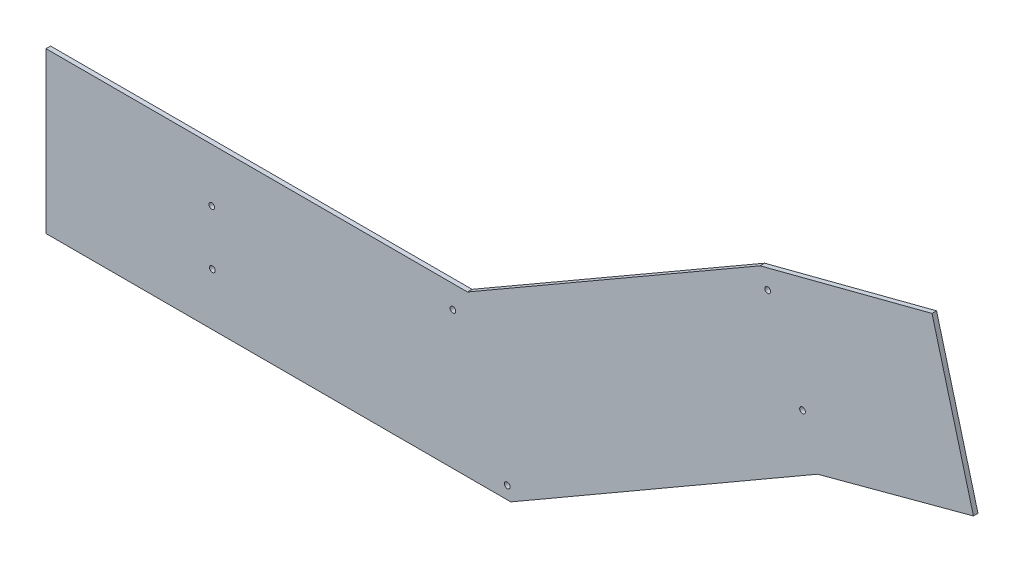
ISO-10303-21;
HEADER;
FILE_DESCRIPTION(('STEP AP214'),'2;1');
FILE_NAME('part.step','',(''),(''),'','','');
FILE_SCHEMA(('AUTOMOTIVE_DESIGN { 1 0 10303 214 1 1 1 1 }'));
ENDSEC;
DATA;
#1=APPLICATION_CONTEXT('core data for automotive mechanical design processes');
#2=APPLICATION_PROTOCOL_DEFINITION('international standard','automotive_design',2000,#1);
#3=PRODUCT_CONTEXT('',#1,'mechanical');
#4=PRODUCT('Part','Part','',(#3));
#5=PRODUCT_RELATED_PRODUCT_CATEGORY('part','',(#4));
#6=PRODUCT_DEFINITION_FORMATION('','',#4);
#7=PRODUCT_DEFINITION_CONTEXT('part definition',#1,'design');
#8=PRODUCT_DEFINITION('design','',#6,#7);
#9=PRODUCT_DEFINITION_SHAPE('','',#8);
#10=(LENGTH_UNIT() NAMED_UNIT(*) SI_UNIT(.MILLI.,.METRE.));
#11=(NAMED_UNIT(*) PLANE_ANGLE_UNIT() SI_UNIT($,.RADIAN.));
#12=(NAMED_UNIT(*) SI_UNIT($,.STERADIAN.) SOLID_ANGLE_UNIT());
#13=UNCERTAINTY_MEASURE_WITH_UNIT(LENGTH_MEASURE(1.E-05),#10,'distance_accuracy_value','');
#14=(GEOMETRIC_REPRESENTATION_CONTEXT(3) GLOBAL_UNCERTAINTY_ASSIGNED_CONTEXT((#13)) GLOBAL_UNIT_ASSIGNED_CONTEXT((#10,
#11,#12)) REPRESENTATION_CONTEXT('',''));
#15=CARTESIAN_POINT('',(0.,0.,0.));
#16=DIRECTION('',(0.,0.,1.));
#17=DIRECTION('',(1.,0.,0.));
#18=AXIS2_PLACEMENT_3D('',#15,#16,#17);
#19=CARTESIAN_POINT('',(-172.3738737223,0.,1.6));
#20=DIRECTION('',(1.,0.,0.));
#21=DIRECTION('',(0.,0.,-1.));
#22=AXIS2_PLACEMENT_3D('',#19,#20,#21);
#23=PLANE('',#22);
#24=DIRECTION('',(0.,-1.,0.));
#25=VECTOR('',#24,1.);
#26=CARTESIAN_POINT('',(-172.3738737223,0.,0.));
#27=LINE('',#26,#25);
#28=CARTESIAN_POINT('',(-172.3738737223,5.2915159966,0.));
#29=VERTEX_POINT('',#28);
#30=CARTESIAN_POINT('',(-172.3738737223,-50.8584876976,0.));
#31=VERTEX_POINT('',#30);
#32=EDGE_CURVE('E156',#29,#31,#27,.T.);
#33=ORIENTED_EDGE('',*,*,#32,.T.);
#34=DIRECTION('',(0.,0.,-1.));
#35=VECTOR('',#34,1.);
#36=CARTESIAN_POINT('',(-172.3738737223,-50.8584876976,1.6));
#37=LINE('',#36,#35);
#38=CARTESIAN_POINT('',(-172.3738737223,-50.8584876976,1.6));
#39=VERTEX_POINT('',#38);
#40=EDGE_CURVE('E11',#39,#31,#37,.T.);
#41=ORIENTED_EDGE('',*,*,#40,.F.);
#42=DIRECTION('',(0.,-1.,0.));
#43=VECTOR('',#42,1.);
#44=CARTESIAN_POINT('',(-172.3738737223,0.,1.6));
#45=LINE('',#44,#43);
#46=CARTESIAN_POINT('',(-172.3738737223,5.2915159966,1.6));
#47=VERTEX_POINT('',#46);
#48=EDGE_CURVE('E206',#47,#39,#45,.T.);
#49=ORIENTED_EDGE('',*,*,#48,.F.);
#50=DIRECTION('',(0.,0.,-1.));
#51=VECTOR('',#50,1.);
#52=CARTESIAN_POINT('',(-172.3738737223,5.2915159966,1.6));
#53=LINE('',#52,#51);
#54=EDGE_CURVE('E134',#47,#29,#53,.T.);
#55=ORIENTED_EDGE('',*,*,#54,.T.);
#56=EDGE_LOOP('',(#33,#41,#49,#55));
#57=FACE_BOUND('',#56,.T.);
#58=ADVANCED_FACE('F41',(#57),#23,.F.);
#59=CARTESIAN_POINT('',(0.,-50.8584876976,1.6));
#60=DIRECTION('',(0.,1.,0.));
#61=DIRECTION('',(0.,0.,1.));
#62=AXIS2_PLACEMENT_3D('',#59,#60,#61);
#63=PLANE('',#62);
#64=DIRECTION('',(1.,0.,0.));
#65=VECTOR('',#64,1.);
#66=CARTESIAN_POINT('',(0.,-50.8584876976,0.));
#67=LINE('',#66,#65);
#68=CARTESIAN_POINT('',(-9.3985925441,-50.8584876976,0.));
#69=VERTEX_POINT('',#68);
#70=EDGE_CURVE('E159',#31,#69,#67,.T.);
#71=ORIENTED_EDGE('',*,*,#70,.T.);
#72=DIRECTION('',(0.,0.,-1.));
#73=VECTOR('',#72,1.);
#74=CARTESIAN_POINT('',(-9.3985925441,-50.8584876976,1.6));
#75=LINE('',#74,#73);
#76=CARTESIAN_POINT('',(-9.3985925441,-50.8584876976,1.6));
#77=VERTEX_POINT('',#76);
#78=EDGE_CURVE('E50',#77,#69,#75,.T.);
#79=ORIENTED_EDGE('',*,*,#78,.F.);
#80=DIRECTION('',(1.,0.,0.));
#81=VECTOR('',#80,1.);
#82=CARTESIAN_POINT('',(0.,-50.8584876976,1.6));
#83=LINE('',#82,#81);
#84=EDGE_CURVE('E97',#39,#77,#83,.T.);
#85=ORIENTED_EDGE('',*,*,#84,.F.);
#86=ORIENTED_EDGE('',*,*,#40,.T.);
#87=EDGE_LOOP('',(#71,#79,#85,#86));
#88=FACE_BOUND('',#87,.T.);
#89=ADVANCED_FACE('F257',(#88),#63,.F.);
#90=CARTESIAN_POINT('',(19.6843399299299,-34.0413349853203,1.6));
#91=DIRECTION('',(-0.500582868753158,0.865688622722315,0.));
#92=DIRECTION('',(-0.865688622722315,-0.500582868753158,0.));
#93=AXIS2_PLACEMENT_3D('',#90,#91,#92);
#94=PLANE('',#93);
#95=DIRECTION('',(0.865688622722315,0.500582868753158,0.));
#96=VECTOR('',#95,1.);
#97=CARTESIAN_POINT('',(19.6843399299299,-34.0413349853203,0.));
#98=LINE('',#97,#96);
#99=CARTESIAN_POINT('',(98.1505954559,11.3316343024,0.));
#100=VERTEX_POINT('',#99);
#101=EDGE_CURVE('E162',#69,#100,#98,.T.);
#102=ORIENTED_EDGE('',*,*,#101,.T.);
#103=DIRECTION('',(0.,0.,-1.));
#104=VECTOR('',#103,1.);
#105=CARTESIAN_POINT('',(98.1505954559,11.3316343024,1.6));
#106=LINE('',#105,#104);
#107=CARTESIAN_POINT('',(98.1505954559,11.3316343024,1.6));
#108=VERTEX_POINT('',#107);
#109=EDGE_CURVE('E180',#108,#100,#106,.T.);
#110=ORIENTED_EDGE('',*,*,#109,.F.);
#111=DIRECTION('',(0.865688622722315,0.500582868753158,0.));
#112=VECTOR('',#111,1.);
#113=CARTESIAN_POINT('',(19.6843399299299,-34.0413349853203,1.6));
#114=LINE('',#113,#112);
#115=EDGE_CURVE('E188',#77,#108,#114,.T.);
#116=ORIENTED_EDGE('',*,*,#115,.F.);
#117=ORIENTED_EDGE('',*,*,#78,.T.);
#118=EDGE_LOOP('',(#102,#110,#116,#117));
#119=FACE_BOUND('',#118,.T.);
#120=ADVANCED_FACE('F186',(#119),#94,.F.);
#121=CARTESIAN_POINT('',(3.73773680687827,-13.9553933314862,1.6));
#122=DIRECTION('',(-0.258715742758168,0.965953500148475,0.));
#123=DIRECTION('',(-0.965953500148475,-0.258715742758168,0.));
#124=AXIS2_PLACEMENT_3D('',#121,#122,#123);
#125=PLANE('',#124);
#126=DIRECTION('',(0.965953500148475,0.258715742758168,0.));
#127=VECTOR('',#126,1.);
#128=CARTESIAN_POINT('',(3.73773680687827,-13.9553933314862,0.));
#129=LINE('',#128,#127);
#130=CARTESIAN_POINT('',(152.8113954559,25.9716863024,0.));
#131=VERTEX_POINT('',#130);
#132=EDGE_CURVE('E164',#100,#131,#129,.T.);
#133=ORIENTED_EDGE('',*,*,#132,.T.);
#134=DIRECTION('',(0.,0.,-1.));
#135=VECTOR('',#134,1.);
#136=CARTESIAN_POINT('',(152.8113954559,25.9716863024,1.6));
#137=LINE('',#136,#135);
#138=CARTESIAN_POINT('',(152.8113954559,25.9716863024,1.6));
#139=VERTEX_POINT('',#138);
#140=EDGE_CURVE('E177',#139,#131,#137,.T.);
#141=ORIENTED_EDGE('',*,*,#140,.F.);
#142=DIRECTION('',(0.965953500148475,0.258715742758168,0.));
#143=VECTOR('',#142,1.);
#144=CARTESIAN_POINT('',(3.73773680687827,-13.9553933314862,1.6));
#145=LINE('',#144,#143);
#146=EDGE_CURVE('E200',#108,#139,#145,.T.);
#147=ORIENTED_EDGE('',*,*,#146,.F.);
#148=ORIENTED_EDGE('',*,*,#109,.T.);
#149=EDGE_LOOP('',(#133,#141,#147,#148));
#150=FACE_BOUND('',#149,.T.);
#151=ADVANCED_FACE('F196',(#150),#125,.F.);
#152=CARTESIAN_POINT('',(149.074751685058,39.9241312300911,1.6));
#153=DIRECTION('',(-0.965958748430131,-0.2586961467268,0.));
#154=DIRECTION('',(0.2586961467268,-0.965958748430131,0.));
#155=AXIS2_PLACEMENT_3D('',#152,#153,#154);
#156=PLANE('',#155);
#157=DIRECTION('',(-0.2586961467268,0.965958748430132,0.));
#158=VECTOR('',#157,1.);
#159=CARTESIAN_POINT('',(149.074751685058,39.9241312300911,0.));
#160=LINE('',#159,#158);
#161=CARTESIAN_POINT('',(138.2825954559,80.2215143024,0.));
#162=VERTEX_POINT('',#161);
#163=EDGE_CURVE('E166',#131,#162,#160,.T.);
#164=ORIENTED_EDGE('',*,*,#163,.T.);
#165=DIRECTION('',(0.,0.,-1.));
#166=VECTOR('',#165,1.);
#167=CARTESIAN_POINT('',(138.2825954559,80.2215143024,1.6));
#168=LINE('',#167,#166);
#169=CARTESIAN_POINT('',(138.2825954559,80.2215143024,1.6));
#170=VERTEX_POINT('',#169);
#171=EDGE_CURVE('E129',#170,#162,#168,.T.);
#172=ORIENTED_EDGE('',*,*,#171,.F.);
#173=DIRECTION('',(-0.2586961467268,0.965958748430132,0.));
#174=VECTOR('',#173,1.);
#175=CARTESIAN_POINT('',(149.074751685058,39.9241312300911,1.6));
#176=LINE('',#175,#174);
#177=EDGE_CURVE('E116',#139,#170,#176,.T.);
#178=ORIENTED_EDGE('',*,*,#177,.F.);
#179=ORIENTED_EDGE('',*,*,#140,.T.);
#180=EDGE_LOOP('',(#164,#172,#178,#179));
#181=FACE_BOUND('',#180,.T.);
#182=ADVANCED_FACE('F199',(#181),#156,.F.);
#183=CARTESIAN_POINT('',(-10.7812892949243,41.4419124083552,1.6));
#184=DIRECTION('',(0.251773670164605,-0.967786143221654,0.));
#185=DIRECTION('',(0.967786143221654,0.251773670164605,0.));
#186=AXIS2_PLACEMENT_3D('',#183,#184,#185);
#187=PLANE('',#186);
#188=DIRECTION('',(-0.967786143221655,-0.251773670164605,0.));
#189=VECTOR('',#188,1.);
#190=CARTESIAN_POINT('',(-10.7812892949243,41.4419124083552,0.));
#191=LINE('',#190,#189);
#192=CARTESIAN_POINT('',(78.0109354559,64.5415863024,0.));
#193=VERTEX_POINT('',#192);
#194=EDGE_CURVE('E125',#162,#193,#191,.T.);
#195=ORIENTED_EDGE('',*,*,#194,.T.);
#196=DIRECTION('',(0.,0.,-1.));
#197=VECTOR('',#196,1.);
#198=CARTESIAN_POINT('',(78.0109354559,64.5415863024,1.6));
#199=LINE('',#198,#197);
#200=CARTESIAN_POINT('',(78.0109354559,64.5415863024,1.6));
#201=VERTEX_POINT('',#200);
#202=EDGE_CURVE('E122',#201,#193,#199,.T.);
#203=ORIENTED_EDGE('',*,*,#202,.F.);
#204=DIRECTION('',(-0.967786143221655,-0.251773670164605,0.));
#205=VECTOR('',#204,1.);
#206=CARTESIAN_POINT('',(-10.7812892949243,41.4419124083552,1.6));
#207=LINE('',#206,#205);
#208=EDGE_CURVE('E110',#170,#201,#207,.T.);
#209=ORIENTED_EDGE('',*,*,#208,.F.);
#210=ORIENTED_EDGE('',*,*,#171,.T.);
#211=EDGE_LOOP('',(#195,#203,#209,#210));
#212=FACE_BOUND('',#211,.T.);
#213=ADVANCED_FACE('F123',(#212),#187,.F.);
#214=CARTESIAN_POINT('',(-8.44354314677224,14.6236412480124,1.6));
#215=DIRECTION('',(-0.500025757578258,0.866010532128963,0.));
#216=DIRECTION('',(-0.866010532128963,-0.500025757578258,0.));
#217=AXIS2_PLACEMENT_3D('',#214,#215,#216);
#218=PLANE('',#217);
#219=DIRECTION('',(0.866010532128963,0.500025757578258,0.));
#220=VECTOR('',#219,1.);
#221=CARTESIAN_POINT('',(-8.44354314677224,14.6236412480124,0.));
#222=LINE('',#221,#220);
#223=CARTESIAN_POINT('',(-24.5885545441,5.3016743024,0.));
#224=VERTEX_POINT('',#223);
#225=EDGE_CURVE('E169',#224,#193,#222,.T.);
#226=ORIENTED_EDGE('',*,*,#225,.F.);
#227=DIRECTION('',(0.,0.,-1.));
#228=VECTOR('',#227,1.);
#229=CARTESIAN_POINT('',(-24.5885545441,5.3016743024,1.6));
#230=LINE('',#229,#228);
#231=CARTESIAN_POINT('',(-24.5885545441,5.3016743024,1.6));
#232=VERTEX_POINT('',#231);
#233=EDGE_CURVE('E86',#232,#224,#230,.T.);
#234=ORIENTED_EDGE('',*,*,#233,.F.);
#235=DIRECTION('',(0.866010532128963,0.500025757578258,0.));
#236=VECTOR('',#235,1.);
#237=CARTESIAN_POINT('',(-8.44354314677224,14.6236412480124,1.6));
#238=LINE('',#237,#236);
#239=EDGE_CURVE('E114',#232,#201,#238,.T.);
#240=ORIENTED_EDGE('',*,*,#239,.T.);
#241=ORIENTED_EDGE('',*,*,#202,.T.);
#242=EDGE_LOOP('',(#226,#234,#240,#241));
#243=FACE_BOUND('',#242,.T.);
#244=ADVANCED_FACE('F131',(#243),#218,.T.);
#245=CARTESIAN_POINT('',(80.6855554559,58.4892743024,1.6));
#246=DIRECTION('',(0.,0.,-1.));
#247=DIRECTION('',(-1.,0.,0.));
#248=AXIS2_PLACEMENT_3D('',#245,#246,#247);
#249=CYLINDRICAL_SURFACE('',#248,1.);
#250=CARTESIAN_POINT('',(80.6855554559,58.4892743024,1.6));
#251=DIRECTION('',(0.,0.,1.));
#252=DIRECTION('',(1.,0.,0.));
#253=AXIS2_PLACEMENT_3D('',#250,#251,#252);
#254=CIRCLE('',#253,1.);
#255=CARTESIAN_POINT('',(81.6855554559,58.4892743024,1.6));
#256=VERTEX_POINT('',#255);
#257=EDGE_CURVE('E208',#256,#256,#254,.T.);
#258=ORIENTED_EDGE('',*,*,#257,.T.);
#259=EDGE_LOOP('',(#258));
#260=FACE_BOUND('',#259,.T.);
#261=CARTESIAN_POINT('',(80.6855554559,58.4892743024,0.));
#262=DIRECTION('',(0.,0.,1.));
#263=DIRECTION('',(1.,0.,0.));
#264=AXIS2_PLACEMENT_3D('',#261,#262,#263);
#265=CIRCLE('',#264,1.);
#266=CARTESIAN_POINT('',(81.6855554559,58.4892743024,0.));
#267=VERTEX_POINT('',#266);
#268=EDGE_CURVE('E153',#267,#267,#265,.T.);
#269=ORIENTED_EDGE('',*,*,#268,.F.);
#270=EDGE_LOOP('',(#269));
#271=FACE_BOUND('',#270,.T.);
#272=ADVANCED_FACE('F242',(#260,#271),#249,.F.);
#273=CARTESIAN_POINT('',(92.8775554559,28.0854743024,1.6));
#274=DIRECTION('',(0.,0.,-1.));
#275=DIRECTION('',(-1.,0.,0.));
#276=AXIS2_PLACEMENT_3D('',#273,#274,#275);
#277=CYLINDRICAL_SURFACE('',#276,1.);
#278=CARTESIAN_POINT('',(92.8775554559,28.0854743024,1.6));
#279=DIRECTION('',(0.,0.,1.));
#280=DIRECTION('',(1.,0.,0.));
#281=AXIS2_PLACEMENT_3D('',#278,#279,#280);
#282=CIRCLE('',#281,1.);
#283=CARTESIAN_POINT('',(93.8775554559,28.0854743024,1.6));
#284=VERTEX_POINT('',#283);
#285=EDGE_CURVE('E211',#284,#284,#282,.T.);
#286=ORIENTED_EDGE('',*,*,#285,.T.);
#287=EDGE_LOOP('',(#286));
#288=FACE_BOUND('',#287,.T.);
#289=CARTESIAN_POINT('',(92.8775554559,28.0854743024,0.));
#290=DIRECTION('',(0.,0.,1.));
#291=DIRECTION('',(1.,0.,0.));
#292=AXIS2_PLACEMENT_3D('',#289,#290,#291);
#293=CIRCLE('',#292,1.);
#294=CARTESIAN_POINT('',(93.8775554559,28.0854743024,0.));
#295=VERTEX_POINT('',#294);
#296=EDGE_CURVE('E150',#295,#295,#293,.T.);
#297=ORIENTED_EDGE('',*,*,#296,.F.);
#298=EDGE_LOOP('',(#297));
#299=FACE_BOUND('',#298,.T.);
#300=ADVANCED_FACE('F245',(#288,#299),#277,.F.);
#301=CARTESIAN_POINT('',(-29.7028445441,-2.6485256976,1.6));
#302=DIRECTION('',(0.,0.,-1.));
#303=DIRECTION('',(-1.,0.,0.));
#304=AXIS2_PLACEMENT_3D('',#301,#302,#303);
#305=CYLINDRICAL_SURFACE('',#304,1.);
#306=CARTESIAN_POINT('',(-29.7028445441,-2.6485256976,1.6));
#307=DIRECTION('',(0.,0.,1.));
#308=DIRECTION('',(1.,0.,0.));
#309=AXIS2_PLACEMENT_3D('',#306,#307,#308);
#310=CIRCLE('',#309,1.);
#311=CARTESIAN_POINT('',(-28.7028445441,-2.6485256976,1.6));
#312=VERTEX_POINT('',#311);
#313=EDGE_CURVE('E214',#312,#312,#310,.T.);
#314=ORIENTED_EDGE('',*,*,#313,.T.);
#315=EDGE_LOOP('',(#314));
#316=FACE_BOUND('',#315,.T.);
#317=CARTESIAN_POINT('',(-29.7028445441,-2.6485256976,0.));
#318=DIRECTION('',(0.,0.,1.));
#319=DIRECTION('',(1.,0.,0.));
#320=AXIS2_PLACEMENT_3D('',#317,#318,#319);
#321=CIRCLE('',#320,1.);
#322=CARTESIAN_POINT('',(-28.7028445441,-2.6485256976,0.));
#323=VERTEX_POINT('',#322);
#324=EDGE_CURVE('E147',#323,#323,#321,.T.);
#325=ORIENTED_EDGE('',*,*,#324,.F.);
#326=EDGE_LOOP('',(#325));
#327=FACE_BOUND('',#326,.T.);
#328=ADVANCED_FACE('F268',(#316,#327),#305,.F.);
#329=CARTESIAN_POINT('',(-10.6528445441,-46.4381256976,1.6));
#330=DIRECTION('',(0.,0.,-1.));
#331=DIRECTION('',(-1.,0.,0.));
#332=AXIS2_PLACEMENT_3D('',#329,#330,#331);
#333=CYLINDRICAL_SURFACE('',#332,0.999999999999999);
#334=CARTESIAN_POINT('',(-10.6528445441,-46.4381256976,1.6));
#335=DIRECTION('',(0.,0.,1.));
#336=DIRECTION('',(1.,0.,0.));
#337=AXIS2_PLACEMENT_3D('',#334,#335,#336);
#338=CIRCLE('',#337,0.999999999999999);
#339=CARTESIAN_POINT('',(-9.6528445441,-46.4381256976,1.6));
#340=VERTEX_POINT('',#339);
#341=EDGE_CURVE('E217',#340,#340,#338,.T.);
#342=ORIENTED_EDGE('',*,*,#341,.T.);
#343=EDGE_LOOP('',(#342));
#344=FACE_BOUND('',#343,.T.);
#345=CARTESIAN_POINT('',(-10.6528445441,-46.4381256976,0.));
#346=DIRECTION('',(0.,0.,1.));
#347=DIRECTION('',(1.,0.,0.));
#348=AXIS2_PLACEMENT_3D('',#345,#346,#347);
#349=CIRCLE('',#348,0.999999999999999);
#350=CARTESIAN_POINT('',(-9.6528445441,-46.4381256976,0.));
#351=VERTEX_POINT('',#350);
#352=EDGE_CURVE('E144',#351,#351,#349,.T.);
#353=ORIENTED_EDGE('',*,*,#352,.F.);
#354=EDGE_LOOP('',(#353));
#355=FACE_BOUND('',#354,.T.);
#356=ADVANCED_FACE('F272',(#344,#355),#333,.F.);
#357=CARTESIAN_POINT('',(-114.2594445441,-13.4181256976,1.6));
#358=DIRECTION('',(0.,0.,-1.));
#359=DIRECTION('',(-1.,0.,0.));
#360=AXIS2_PLACEMENT_3D('',#357,#358,#359);
#361=CYLINDRICAL_SURFACE('',#360,1.);
#362=CARTESIAN_POINT('',(-114.2594445441,-13.4181256976,1.6));
#363=DIRECTION('',(0.,0.,1.));
#364=DIRECTION('',(1.,0.,0.));
#365=AXIS2_PLACEMENT_3D('',#362,#363,#364);
#366=CIRCLE('',#365,1.);
#367=CARTESIAN_POINT('',(-113.2594445441,-13.4181256976,1.6));
#368=VERTEX_POINT('',#367);
#369=EDGE_CURVE('E220',#368,#368,#366,.T.);
#370=ORIENTED_EDGE('',*,*,#369,.T.);
#371=EDGE_LOOP('',(#370));
#372=FACE_BOUND('',#371,.T.);
#373=CARTESIAN_POINT('',(-114.2594445441,-13.4181256976,0.));
#374=DIRECTION('',(0.,0.,1.));
#375=DIRECTION('',(1.,0.,0.));
#376=AXIS2_PLACEMENT_3D('',#373,#374,#375);
#377=CIRCLE('',#376,1.);
#378=CARTESIAN_POINT('',(-113.2594445441,-13.4181256976,0.));
#379=VERTEX_POINT('',#378);
#380=EDGE_CURVE('E141',#379,#379,#377,.T.);
#381=ORIENTED_EDGE('',*,*,#380,.F.);
#382=EDGE_LOOP('',(#381));
#383=FACE_BOUND('',#382,.T.);
#384=ADVANCED_FACE('F275',(#372,#383),#361,.F.);
#385=CARTESIAN_POINT('',(-114.0308445441,-32.4935256976,1.6));
#386=DIRECTION('',(0.,0.,-1.));
#387=DIRECTION('',(-1.,0.,0.));
#388=AXIS2_PLACEMENT_3D('',#385,#386,#387);
#389=CYLINDRICAL_SURFACE('',#388,1.);
#390=CARTESIAN_POINT('',(-114.0308445441,-32.4935256976,1.6));
#391=DIRECTION('',(0.,0.,1.));
#392=DIRECTION('',(1.,0.,0.));
#393=AXIS2_PLACEMENT_3D('',#390,#391,#392);
#394=CIRCLE('',#393,1.);
#395=CARTESIAN_POINT('',(-113.0308445441,-32.4935256976,1.6));
#396=VERTEX_POINT('',#395);
#397=EDGE_CURVE('E173',#396,#396,#394,.T.);
#398=ORIENTED_EDGE('',*,*,#397,.T.);
#399=EDGE_LOOP('',(#398));
#400=FACE_BOUND('',#399,.T.);
#401=CARTESIAN_POINT('',(-114.0308445441,-32.4935256976,0.));
#402=DIRECTION('',(0.,0.,1.));
#403=DIRECTION('',(1.,0.,0.));
#404=AXIS2_PLACEMENT_3D('',#401,#402,#403);
#405=CIRCLE('',#404,1.);
#406=CARTESIAN_POINT('',(-113.0308445441,-32.4935256976,0.));
#407=VERTEX_POINT('',#406);
#408=EDGE_CURVE('E138',#407,#407,#405,.T.);
#409=ORIENTED_EDGE('',*,*,#408,.F.);
#410=EDGE_LOOP('',(#409));
#411=FACE_BOUND('',#410,.T.);
#412=ADVANCED_FACE('F43',(#400,#411),#389,.F.);
#413=CARTESIAN_POINT('',(-0.000364536868966013,5.30336441853976,1.6));
#414=DIRECTION('',(6.87369072414621E-05,-0.999999997637619,0.));
#415=DIRECTION('',(0.999999997637619,6.87369072414621E-05,0.));
#416=AXIS2_PLACEMENT_3D('',#413,#414,#415);
#417=PLANE('',#416);
#418=DIRECTION('',(-0.999999997637619,-6.87369072414621E-05,0.));
#419=VECTOR('',#418,1.);
#420=CARTESIAN_POINT('',(-0.000364536868966013,5.30336441853976,0.));
#421=LINE('',#420,#419);
#422=EDGE_CURVE('E89',#224,#29,#421,.T.);
#423=ORIENTED_EDGE('',*,*,#422,.T.);
#424=ORIENTED_EDGE('',*,*,#54,.F.);
#425=DIRECTION('',(-0.999999997637619,-6.87369072414621E-05,0.));
#426=VECTOR('',#425,1.);
#427=CARTESIAN_POINT('',(-0.000364536868966013,5.30336441853976,1.6));
#428=LINE('',#427,#426);
#429=EDGE_CURVE('E58',#232,#47,#428,.T.);
#430=ORIENTED_EDGE('',*,*,#429,.F.);
#431=ORIENTED_EDGE('',*,*,#233,.T.);
#432=EDGE_LOOP('',(#423,#424,#430,#431));
#433=FACE_BOUND('',#432,.T.);
#434=ADVANCED_FACE('F230',(#433),#417,.F.);
#435=CARTESIAN_POINT('',(0.,0.,1.6));
#436=DIRECTION('',(0.,0.,1.));
#437=DIRECTION('',(1.,0.,0.));
#438=AXIS2_PLACEMENT_3D('',#435,#436,#437);
#439=PLANE('',#438);
#440=ORIENTED_EDGE('',*,*,#397,.F.);
#441=EDGE_LOOP('',(#440));
#442=FACE_BOUND('',#441,.T.);
#443=ORIENTED_EDGE('',*,*,#369,.F.);
#444=EDGE_LOOP('',(#443));
#445=FACE_BOUND('',#444,.T.);
#446=ORIENTED_EDGE('',*,*,#341,.F.);
#447=EDGE_LOOP('',(#446));
#448=FACE_BOUND('',#447,.T.);
#449=ORIENTED_EDGE('',*,*,#313,.F.);
#450=EDGE_LOOP('',(#449));
#451=FACE_BOUND('',#450,.T.);
#452=ORIENTED_EDGE('',*,*,#285,.F.);
#453=EDGE_LOOP('',(#452));
#454=FACE_BOUND('',#453,.T.);
#455=ORIENTED_EDGE('',*,*,#257,.F.);
#456=EDGE_LOOP('',(#455));
#457=FACE_BOUND('',#456,.T.);
#458=ORIENTED_EDGE('',*,*,#48,.T.);
#459=ORIENTED_EDGE('',*,*,#84,.T.);
#460=ORIENTED_EDGE('',*,*,#115,.T.);
#461=ORIENTED_EDGE('',*,*,#146,.T.);
#462=ORIENTED_EDGE('',*,*,#177,.T.);
#463=ORIENTED_EDGE('',*,*,#208,.T.);
#464=ORIENTED_EDGE('',*,*,#239,.F.);
#465=ORIENTED_EDGE('',*,*,#429,.T.);
#466=EDGE_LOOP('',(#458,#459,#460,#461,#462,#463,#464,#465));
#467=FACE_BOUND('',#466,.T.);
#468=ADVANCED_FACE('F112',(#442,#445,#448,#451,#454,#457,#467),#439,.T.);
#469=CARTESIAN_POINT('',(0.,0.,0.));
#470=DIRECTION('',(0.,0.,1.));
#471=DIRECTION('',(1.,0.,0.));
#472=AXIS2_PLACEMENT_3D('',#469,#470,#471);
#473=PLANE('',#472);
#474=ORIENTED_EDGE('',*,*,#408,.T.);
#475=EDGE_LOOP('',(#474));
#476=FACE_BOUND('',#475,.T.);
#477=ORIENTED_EDGE('',*,*,#380,.T.);
#478=EDGE_LOOP('',(#477));
#479=FACE_BOUND('',#478,.T.);
#480=ORIENTED_EDGE('',*,*,#352,.T.);
#481=EDGE_LOOP('',(#480));
#482=FACE_BOUND('',#481,.T.);
#483=ORIENTED_EDGE('',*,*,#324,.T.);
#484=EDGE_LOOP('',(#483));
#485=FACE_BOUND('',#484,.T.);
#486=ORIENTED_EDGE('',*,*,#296,.T.);
#487=EDGE_LOOP('',(#486));
#488=FACE_BOUND('',#487,.T.);
#489=ORIENTED_EDGE('',*,*,#268,.T.);
#490=EDGE_LOOP('',(#489));
#491=FACE_BOUND('',#490,.T.);
#492=ORIENTED_EDGE('',*,*,#32,.F.);
#493=ORIENTED_EDGE('',*,*,#422,.F.);
#494=ORIENTED_EDGE('',*,*,#225,.T.);
#495=ORIENTED_EDGE('',*,*,#194,.F.);
#496=ORIENTED_EDGE('',*,*,#163,.F.);
#497=ORIENTED_EDGE('',*,*,#132,.F.);
#498=ORIENTED_EDGE('',*,*,#101,.F.);
#499=ORIENTED_EDGE('',*,*,#70,.F.);
#500=EDGE_LOOP('',(#492,#493,#494,#495,#496,#497,#498,#499));
#501=FACE_BOUND('',#500,.T.);
#502=ADVANCED_FACE('F192',(#476,#479,#482,#485,#488,#491,#501),#473,.F.);
#503=CLOSED_SHELL('',(#58,#89,#120,#151,#182,#213,#244,#272,#300,#328,#356,#384,#412,#434,#468,#502));
#504=MANIFOLD_SOLID_BREP('B2',#503);
#505=ADVANCED_BREP_SHAPE_REPRESENTATION('',(#18,#504),#14);
#506=SHAPE_DEFINITION_REPRESENTATION(#9,#505);
ENDSEC;
END-ISO-10303-21;
